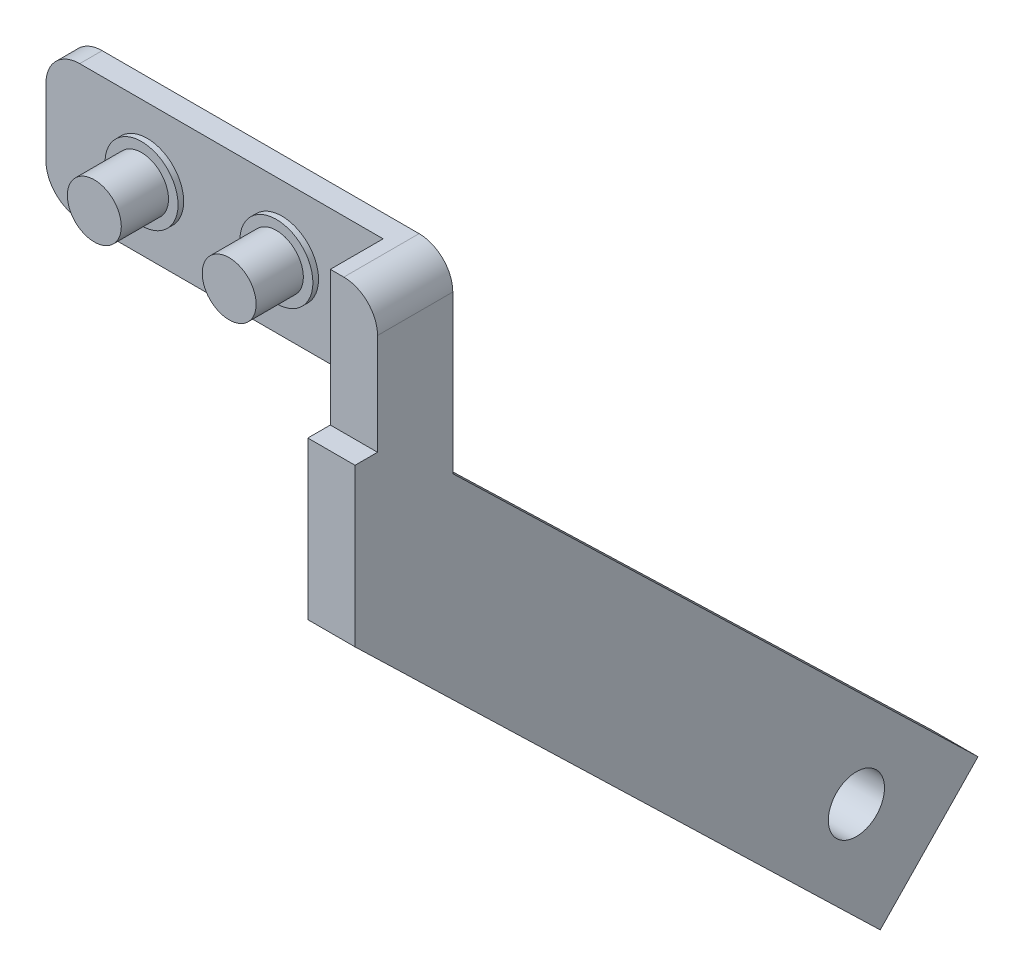
ISO-10303-21;
HEADER;
FILE_DESCRIPTION(('STEP AP214'),'2;1');
FILE_NAME('part.step','',(''),(''),'','','');
FILE_SCHEMA(('AUTOMOTIVE_DESIGN { 1 0 10303 214 1 1 1 1 }'));
ENDSEC;
DATA;
#1=APPLICATION_CONTEXT('core data for automotive mechanical design processes');
#2=APPLICATION_PROTOCOL_DEFINITION('international standard','automotive_design',2000,#1);
#3=PRODUCT_CONTEXT('',#1,'mechanical');
#4=PRODUCT('Part','Part','',(#3));
#5=PRODUCT_RELATED_PRODUCT_CATEGORY('part','',(#4));
#6=PRODUCT_DEFINITION_FORMATION('','',#4);
#7=PRODUCT_DEFINITION_CONTEXT('part definition',#1,'design');
#8=PRODUCT_DEFINITION('design','',#6,#7);
#9=PRODUCT_DEFINITION_SHAPE('','',#8);
#10=(LENGTH_UNIT() NAMED_UNIT(*) SI_UNIT(.MILLI.,.METRE.));
#11=(NAMED_UNIT(*) PLANE_ANGLE_UNIT() SI_UNIT($,.RADIAN.));
#12=(NAMED_UNIT(*) SI_UNIT($,.STERADIAN.) SOLID_ANGLE_UNIT());
#13=UNCERTAINTY_MEASURE_WITH_UNIT(LENGTH_MEASURE(1.E-05),#10,'distance_accuracy_value','');
#14=(GEOMETRIC_REPRESENTATION_CONTEXT(3) GLOBAL_UNCERTAINTY_ASSIGNED_CONTEXT((#13)) GLOBAL_UNIT_ASSIGNED_CONTEXT((#10,
#11,#12)) REPRESENTATION_CONTEXT('',''));
#15=CARTESIAN_POINT('',(0.,0.,0.));
#16=DIRECTION('',(0.,0.,1.));
#17=DIRECTION('',(1.,0.,0.));
#18=AXIS2_PLACEMENT_3D('',#15,#16,#17);
#19=CARTESIAN_POINT('',(21.3907010979574,4.97647058823529,6.7));
#20=DIRECTION('',(0.,0.,-1.));
#21=DIRECTION('',(0.,1.,0.));
#22=AXIS2_PLACEMENT_3D('',#19,#20,#21);
#23=PLANE('',#22);
#24=DIRECTION('',(0.,-1.,0.));
#25=VECTOR('',#24,1.);
#26=CARTESIAN_POINT('',(21.3907010979574,4.97647058823529,6.7));
#27=LINE('',#26,#25);
#28=CARTESIAN_POINT('',(21.3907010979574,1.97647058823529,6.7));
#29=VERTEX_POINT('',#28);
#30=CARTESIAN_POINT('',(21.3907010979574,-7.02352941176471,6.7));
#31=VERTEX_POINT('',#30);
#32=EDGE_CURVE('E186',#29,#31,#27,.T.);
#33=ORIENTED_EDGE('',*,*,#32,.F.);
#34=CARTESIAN_POINT('',(18.3907010979574,1.97647058823529,6.7));
#35=DIRECTION('',(0.,0.,-1.));
#36=DIRECTION('',(0.,1.,0.));
#37=AXIS2_PLACEMENT_3D('',#34,#35,#36);
#38=CIRCLE('',#37,3.);
#39=CARTESIAN_POINT('',(18.3907010979574,4.97647058823529,6.7));
#40=VERTEX_POINT('',#39);
#41=EDGE_CURVE('E246',#29,#40,#38,.F.);
#42=ORIENTED_EDGE('',*,*,#41,.T.);
#43=DIRECTION('',(-1.,0.,0.));
#44=VECTOR('',#43,1.);
#45=CARTESIAN_POINT('',(21.3907010979574,4.97647058823529,6.7));
#46=LINE('',#45,#44);
#47=CARTESIAN_POINT('',(17.1907010979574,4.97647058823529,6.7));
#48=VERTEX_POINT('',#47);
#49=EDGE_CURVE('E198',#40,#48,#46,.T.);
#50=ORIENTED_EDGE('',*,*,#49,.T.);
#51=DIRECTION('',(0.,-1.,0.));
#52=VECTOR('',#51,1.);
#53=CARTESIAN_POINT('',(17.1907010979574,4.97647058823529,6.7));
#54=LINE('',#53,#52);
#55=CARTESIAN_POINT('',(17.1907010979574,-7.02352941176471,6.7));
#56=VERTEX_POINT('',#55);
#57=EDGE_CURVE('E187',#48,#56,#54,.T.);
#58=ORIENTED_EDGE('',*,*,#57,.T.);
#59=DIRECTION('',(-1.,0.,0.));
#60=VECTOR('',#59,1.);
#61=CARTESIAN_POINT('',(17.1907010979574,-7.02352941176471,6.7));
#62=LINE('',#61,#60);
#63=EDGE_CURVE('E163',#31,#56,#62,.T.);
#64=ORIENTED_EDGE('',*,*,#63,.F.);
#65=EDGE_LOOP('',(#33,#42,#50,#58,#64));
#66=FACE_BOUND('',#65,.T.);
#67=ADVANCED_FACE('F32',(#66),#23,.F.);
#68=CARTESIAN_POINT('',(-12.8092989020426,4.97647058823529,2.));
#69=DIRECTION('',(1.,0.,0.));
#70=DIRECTION('',(0.,1.,0.));
#71=AXIS2_PLACEMENT_3D('',#68,#69,#70);
#72=PLANE('',#71);
#73=DIRECTION('',(0.,-1.,0.));
#74=VECTOR('',#73,1.);
#75=CARTESIAN_POINT('',(-12.8092989020426,4.97647058823529,2.));
#76=LINE('',#75,#74);
#77=CARTESIAN_POINT('',(-12.8092989020426,1.97647058823529,2.));
#78=VERTEX_POINT('',#77);
#79=CARTESIAN_POINT('',(-12.8092989020426,-4.02352941176471,2.));
#80=VERTEX_POINT('',#79);
#81=EDGE_CURVE('E225',#78,#80,#76,.T.);
#82=ORIENTED_EDGE('',*,*,#81,.F.);
#83=DIRECTION('',(0.,0.,-1.));
#84=VECTOR('',#83,1.);
#85=CARTESIAN_POINT('',(-12.8092989020426,1.97647058823529,2.));
#86=LINE('',#85,#84);
#87=CARTESIAN_POINT('',(-12.8092989020426,1.97647058823529,0.));
#88=VERTEX_POINT('',#87);
#89=EDGE_CURVE('E259',#78,#88,#86,.T.);
#90=ORIENTED_EDGE('',*,*,#89,.T.);
#91=DIRECTION('',(0.,-1.,0.));
#92=VECTOR('',#91,1.);
#93=CARTESIAN_POINT('',(-12.8092989020426,4.97647058823529,0.));
#94=LINE('',#93,#92);
#95=CARTESIAN_POINT('',(-12.8092989020426,-4.02352941176471,0.));
#96=VERTEX_POINT('',#95);
#97=EDGE_CURVE('E222',#88,#96,#94,.T.);
#98=ORIENTED_EDGE('',*,*,#97,.T.);
#99=DIRECTION('',(0.,0.,-1.));
#100=VECTOR('',#99,1.);
#101=CARTESIAN_POINT('',(-12.8092989020426,-4.02352941176471,2.));
#102=LINE('',#101,#100);
#103=EDGE_CURVE('E55',#96,#80,#102,.F.);
#104=ORIENTED_EDGE('',*,*,#103,.T.);
#105=EDGE_LOOP('',(#82,#90,#98,#104));
#106=FACE_BOUND('',#105,.T.);
#107=ADVANCED_FACE('F268',(#106),#72,.F.);
#108=CARTESIAN_POINT('',(-12.8092989020426,-7.02352941176471,2.));
#109=DIRECTION('',(0.,1.,0.));
#110=DIRECTION('',(0.,0.,1.));
#111=AXIS2_PLACEMENT_3D('',#108,#109,#110);
#112=PLANE('',#111);
#113=DIRECTION('',(1.,0.,0.));
#114=VECTOR('',#113,1.);
#115=CARTESIAN_POINT('',(-12.8092989020426,-7.02352941176471,2.));
#116=LINE('',#115,#114);
#117=CARTESIAN_POINT('',(-9.80929890204256,-7.02352941176471,2.));
#118=VERTEX_POINT('',#117);
#119=CARTESIAN_POINT('',(17.1907010979574,-7.02352941176471,2.));
#120=VERTEX_POINT('',#119);
#121=EDGE_CURVE('E227',#118,#120,#116,.T.);
#122=ORIENTED_EDGE('',*,*,#121,.F.);
#123=DIRECTION('',(0.,0.,-1.));
#124=VECTOR('',#123,1.);
#125=CARTESIAN_POINT('',(-9.80929890204256,-7.02352941176471,2.));
#126=LINE('',#125,#124);
#127=CARTESIAN_POINT('',(-9.80929890204256,-7.02352941176471,0.));
#128=VERTEX_POINT('',#127);
#129=EDGE_CURVE('E11',#118,#128,#126,.T.);
#130=ORIENTED_EDGE('',*,*,#129,.T.);
#131=DIRECTION('',(1.,0.,0.));
#132=VECTOR('',#131,1.);
#133=CARTESIAN_POINT('',(-12.8092989020426,-7.02352941176471,0.));
#134=LINE('',#133,#132);
#135=CARTESIAN_POINT('',(17.1907010979574,-7.02352941176471,0.));
#136=VERTEX_POINT('',#135);
#137=EDGE_CURVE('E237',#128,#136,#134,.T.);
#138=ORIENTED_EDGE('',*,*,#137,.T.);
#139=DIRECTION('',(0.,0.,-1.));
#140=VECTOR('',#139,1.);
#141=CARTESIAN_POINT('',(17.1907010979574,-7.02352941176471,2.));
#142=LINE('',#141,#140);
#143=EDGE_CURVE('E235',#120,#136,#142,.T.);
#144=ORIENTED_EDGE('',*,*,#143,.F.);
#145=EDGE_LOOP('',(#122,#130,#138,#144));
#146=FACE_BOUND('',#145,.T.);
#147=ADVANCED_FACE('F337',(#146),#112,.F.);
#148=CARTESIAN_POINT('',(-12.8092989020426,4.97647058823529,2.));
#149=DIRECTION('',(0.,-1.,0.));
#150=DIRECTION('',(0.,0.,-1.));
#151=AXIS2_PLACEMENT_3D('',#148,#149,#150);
#152=PLANE('',#151);
#153=ORIENTED_EDGE('',*,*,#49,.F.);
#154=DIRECTION('',(0.,0.,1.));
#155=VECTOR('',#154,1.);
#156=CARTESIAN_POINT('',(18.3907010979574,4.97647058823529,2.));
#157=LINE('',#156,#155);
#158=CARTESIAN_POINT('',(18.3907010979574,4.97647058823529,0.));
#159=VERTEX_POINT('',#158);
#160=EDGE_CURVE('E250',#40,#159,#157,.F.);
#161=ORIENTED_EDGE('',*,*,#160,.T.);
#162=DIRECTION('',(-1.,0.,0.));
#163=VECTOR('',#162,1.);
#164=CARTESIAN_POINT('',(-12.8092989020426,4.97647058823529,0.));
#165=LINE('',#164,#163);
#166=CARTESIAN_POINT('',(-9.80929890204256,4.97647058823529,0.));
#167=VERTEX_POINT('',#166);
#168=EDGE_CURVE('E228',#159,#167,#165,.T.);
#169=ORIENTED_EDGE('',*,*,#168,.T.);
#170=DIRECTION('',(0.,0.,-1.));
#171=VECTOR('',#170,1.);
#172=CARTESIAN_POINT('',(-9.80929890204256,4.97647058823529,2.));
#173=LINE('',#172,#171);
#174=CARTESIAN_POINT('',(-9.80929890204256,4.97647058823529,2.));
#175=VERTEX_POINT('',#174);
#176=EDGE_CURVE('E248',#167,#175,#173,.F.);
#177=ORIENTED_EDGE('',*,*,#176,.T.);
#178=DIRECTION('',(-1.,0.,0.));
#179=VECTOR('',#178,1.);
#180=CARTESIAN_POINT('',(-12.8092989020426,4.97647058823529,2.));
#181=LINE('',#180,#179);
#182=CARTESIAN_POINT('',(17.1907010979574,4.97647058823529,2.));
#183=VERTEX_POINT('',#182);
#184=EDGE_CURVE('E232',#183,#175,#181,.T.);
#185=ORIENTED_EDGE('',*,*,#184,.F.);
#186=DIRECTION('',(0.,0.,1.));
#187=VECTOR('',#186,1.);
#188=CARTESIAN_POINT('',(17.1907010979574,4.97647058823529,0.));
#189=LINE('',#188,#187);
#190=EDGE_CURVE('E192',#183,#48,#189,.T.);
#191=ORIENTED_EDGE('',*,*,#190,.T.);
#192=EDGE_LOOP('',(#153,#161,#169,#177,#185,#191));
#193=FACE_BOUND('',#192,.T.);
#194=ADVANCED_FACE('F277',(#193),#152,.F.);
#195=CARTESIAN_POINT('',(0.,0.,2.));
#196=DIRECTION('',(0.,0.,1.));
#197=DIRECTION('',(1.,0.,0.));
#198=AXIS2_PLACEMENT_3D('',#195,#196,#197);
#199=PLANE('',#198);
#200=CARTESIAN_POINT('',(-3.80929890204256,-1.02352941176471,2.));
#201=DIRECTION('',(0.,0.,1.));
#202=DIRECTION('',(1.,0.,0.));
#203=AXIS2_PLACEMENT_3D('',#200,#201,#202);
#204=CIRCLE('',#203,3.25);
#205=CARTESIAN_POINT('',(-0.55929890204256,-1.02352941176471,2.));
#206=VERTEX_POINT('',#205);
#207=EDGE_CURVE('E210',#206,#206,#204,.T.);
#208=ORIENTED_EDGE('',*,*,#207,.F.);
#209=EDGE_LOOP('',(#208));
#210=FACE_BOUND('',#209,.T.);
#211=CARTESIAN_POINT('',(8.19070109795744,-1.02352941176471,2.));
#212=DIRECTION('',(0.,0.,1.));
#213=DIRECTION('',(1.,0.,0.));
#214=AXIS2_PLACEMENT_3D('',#211,#212,#213);
#215=CIRCLE('',#214,3.25);
#216=CARTESIAN_POINT('',(11.4407010979574,-1.02352941176471,2.));
#217=VERTEX_POINT('',#216);
#218=EDGE_CURVE('E216',#217,#217,#215,.T.);
#219=ORIENTED_EDGE('',*,*,#218,.F.);
#220=EDGE_LOOP('',(#219));
#221=FACE_BOUND('',#220,.T.);
#222=ORIENTED_EDGE('',*,*,#184,.T.);
#223=CARTESIAN_POINT('',(-9.80929890204256,1.97647058823529,2.));
#224=DIRECTION('',(0.,0.,1.));
#225=DIRECTION('',(1.,0.,0.));
#226=AXIS2_PLACEMENT_3D('',#223,#224,#225);
#227=CIRCLE('',#226,3.);
#228=EDGE_CURVE('E40',#175,#78,#227,.T.);
#229=ORIENTED_EDGE('',*,*,#228,.T.);
#230=ORIENTED_EDGE('',*,*,#81,.T.);
#231=CARTESIAN_POINT('',(-9.80929890204256,-4.02352941176471,2.));
#232=DIRECTION('',(0.,0.,1.));
#233=DIRECTION('',(1.,0.,0.));
#234=AXIS2_PLACEMENT_3D('',#231,#232,#233);
#235=CIRCLE('',#234,3.);
#236=EDGE_CURVE('E47',#80,#118,#235,.T.);
#237=ORIENTED_EDGE('',*,*,#236,.T.);
#238=ORIENTED_EDGE('',*,*,#121,.T.);
#239=DIRECTION('',(0.,1.,0.));
#240=VECTOR('',#239,1.);
#241=CARTESIAN_POINT('',(17.1907010979574,4.97647058823529,2.));
#242=LINE('',#241,#240);
#243=EDGE_CURVE('E230',#120,#183,#242,.T.);
#244=ORIENTED_EDGE('',*,*,#243,.T.);
#245=EDGE_LOOP('',(#222,#229,#230,#237,#238,#244));
#246=FACE_BOUND('',#245,.T.);
#247=ADVANCED_FACE('F263',(#210,#221,#246),#199,.T.);
#248=CARTESIAN_POINT('',(0.,0.,0.));
#249=DIRECTION('',(0.,0.,1.));
#250=DIRECTION('',(1.,0.,0.));
#251=AXIS2_PLACEMENT_3D('',#248,#249,#250);
#252=PLANE('',#251);
#253=ORIENTED_EDGE('',*,*,#168,.F.);
#254=CARTESIAN_POINT('',(18.3907010979574,1.97647058823529,0.));
#255=DIRECTION('',(0.,0.,1.));
#256=DIRECTION('',(1.,0.,0.));
#257=AXIS2_PLACEMENT_3D('',#254,#255,#256);
#258=CIRCLE('',#257,3.);
#259=CARTESIAN_POINT('',(21.3907010979574,1.97647058823529,0.));
#260=VERTEX_POINT('',#259);
#261=EDGE_CURVE('E256',#159,#260,#258,.F.);
#262=ORIENTED_EDGE('',*,*,#261,.T.);
#263=DIRECTION('',(0.,1.,0.));
#264=VECTOR('',#263,1.);
#265=CARTESIAN_POINT('',(21.3907010979574,4.97647058823529,0.));
#266=LINE('',#265,#264);
#267=CARTESIAN_POINT('',(21.3907010979574,-12.0235294117647,0.));
#268=VERTEX_POINT('',#267);
#269=EDGE_CURVE('E184',#268,#260,#266,.T.);
#270=ORIENTED_EDGE('',*,*,#269,.F.);
#271=DIRECTION('',(-1.,0.,0.));
#272=VECTOR('',#271,1.);
#273=CARTESIAN_POINT('',(21.3907010979574,-12.0235294117647,0.));
#274=LINE('',#273,#272);
#275=CARTESIAN_POINT('',(17.1907010979574,-12.0235294117647,0.));
#276=VERTEX_POINT('',#275);
#277=EDGE_CURVE('E189',#268,#276,#274,.T.);
#278=ORIENTED_EDGE('',*,*,#277,.T.);
#279=DIRECTION('',(0.,1.,0.));
#280=VECTOR('',#279,1.);
#281=CARTESIAN_POINT('',(17.1907010979574,4.97647058823529,0.));
#282=LINE('',#281,#280);
#283=EDGE_CURVE('E183',#276,#136,#282,.T.);
#284=ORIENTED_EDGE('',*,*,#283,.T.);
#285=ORIENTED_EDGE('',*,*,#137,.F.);
#286=CARTESIAN_POINT('',(-9.80929890204256,-4.02352941176471,0.));
#287=DIRECTION('',(0.,0.,1.));
#288=DIRECTION('',(1.,0.,0.));
#289=AXIS2_PLACEMENT_3D('',#286,#287,#288);
#290=CIRCLE('',#289,3.);
#291=EDGE_CURVE('E252',#128,#96,#290,.F.);
#292=ORIENTED_EDGE('',*,*,#291,.T.);
#293=ORIENTED_EDGE('',*,*,#97,.F.);
#294=CARTESIAN_POINT('',(-9.80929890204256,1.97647058823529,0.));
#295=DIRECTION('',(0.,0.,1.));
#296=DIRECTION('',(1.,0.,0.));
#297=AXIS2_PLACEMENT_3D('',#294,#295,#296);
#298=CIRCLE('',#297,3.);
#299=EDGE_CURVE('E254',#88,#167,#298,.F.);
#300=ORIENTED_EDGE('',*,*,#299,.T.);
#301=EDGE_LOOP('',(#253,#262,#270,#278,#284,#285,#292,#293,#300));
#302=FACE_BOUND('',#301,.T.);
#303=ADVANCED_FACE('F273',(#302),#252,.F.);
#304=CARTESIAN_POINT('',(8.19070109795744,-1.02352941176471,2.5));
#305=DIRECTION('',(0.,0.,-1.));
#306=DIRECTION('',(-1.,0.,0.));
#307=AXIS2_PLACEMENT_3D('',#304,#305,#306);
#308=CYLINDRICAL_SURFACE('',#307,3.25);
#309=CARTESIAN_POINT('',(8.19070109795744,-1.02352941176471,2.5));
#310=DIRECTION('',(0.,0.,1.));
#311=DIRECTION('',(1.,0.,0.));
#312=AXIS2_PLACEMENT_3D('',#309,#310,#311);
#313=CIRCLE('',#312,3.25);
#314=CARTESIAN_POINT('',(11.4407010979574,-1.02352941176471,2.5));
#315=VERTEX_POINT('',#314);
#316=EDGE_CURVE('E219',#315,#315,#313,.T.);
#317=ORIENTED_EDGE('',*,*,#316,.F.);
#318=EDGE_LOOP('',(#317));
#319=FACE_BOUND('',#318,.T.);
#320=ORIENTED_EDGE('',*,*,#218,.T.);
#321=EDGE_LOOP('',(#320));
#322=FACE_BOUND('',#321,.T.);
#323=ADVANCED_FACE('F367',(#319,#322),#308,.T.);
#324=CARTESIAN_POINT('',(8.19070109795744,-1.02352941176471,2.5));
#325=DIRECTION('',(0.,0.,1.));
#326=DIRECTION('',(1.,0.,0.));
#327=AXIS2_PLACEMENT_3D('',#324,#325,#326);
#328=PLANE('',#327);
#329=CARTESIAN_POINT('',(8.19070109795744,-1.02352941176471,2.5));
#330=DIRECTION('',(0.,0.,1.));
#331=DIRECTION('',(1.,0.,0.));
#332=AXIS2_PLACEMENT_3D('',#329,#330,#331);
#333=CIRCLE('',#332,2.4);
#334=CARTESIAN_POINT('',(10.5907010979574,-1.02352941176471,2.5));
#335=VERTEX_POINT('',#334);
#336=EDGE_CURVE('E200',#335,#335,#333,.T.);
#337=ORIENTED_EDGE('',*,*,#336,.F.);
#338=EDGE_LOOP('',(#337));
#339=FACE_BOUND('',#338,.T.);
#340=ORIENTED_EDGE('',*,*,#316,.T.);
#341=EDGE_LOOP('',(#340));
#342=FACE_BOUND('',#341,.T.);
#343=ADVANCED_FACE('F363',(#339,#342),#328,.T.);
#344=CARTESIAN_POINT('',(-3.80929890204256,-1.02352941176471,2.5));
#345=DIRECTION('',(0.,0.,-1.));
#346=DIRECTION('',(-1.,0.,0.));
#347=AXIS2_PLACEMENT_3D('',#344,#345,#346);
#348=CYLINDRICAL_SURFACE('',#347,3.25);
#349=CARTESIAN_POINT('',(-3.80929890204256,-1.02352941176471,2.5));
#350=DIRECTION('',(0.,0.,1.));
#351=DIRECTION('',(1.,0.,0.));
#352=AXIS2_PLACEMENT_3D('',#349,#350,#351);
#353=CIRCLE('',#352,3.25);
#354=CARTESIAN_POINT('',(-0.55929890204256,-1.02352941176471,2.5));
#355=VERTEX_POINT('',#354);
#356=EDGE_CURVE('E213',#355,#355,#353,.T.);
#357=ORIENTED_EDGE('',*,*,#356,.F.);
#358=EDGE_LOOP('',(#357));
#359=FACE_BOUND('',#358,.T.);
#360=ORIENTED_EDGE('',*,*,#207,.T.);
#361=EDGE_LOOP('',(#360));
#362=FACE_BOUND('',#361,.T.);
#363=ADVANCED_FACE('F359',(#359,#362),#348,.T.);
#364=CARTESIAN_POINT('',(-3.80929890204256,-1.02352941176471,2.5));
#365=DIRECTION('',(0.,0.,1.));
#366=DIRECTION('',(1.,0.,0.));
#367=AXIS2_PLACEMENT_3D('',#364,#365,#366);
#368=PLANE('',#367);
#369=CARTESIAN_POINT('',(-3.80929890204256,-1.02352941176471,2.5));
#370=DIRECTION('',(0.,0.,1.));
#371=DIRECTION('',(1.,0.,0.));
#372=AXIS2_PLACEMENT_3D('',#369,#370,#371);
#373=CIRCLE('',#372,2.4);
#374=CARTESIAN_POINT('',(-1.40929890204256,-1.02352941176471,2.5));
#375=VERTEX_POINT('',#374);
#376=EDGE_CURVE('E204',#375,#375,#373,.T.);
#377=ORIENTED_EDGE('',*,*,#376,.F.);
#378=EDGE_LOOP('',(#377));
#379=FACE_BOUND('',#378,.T.);
#380=ORIENTED_EDGE('',*,*,#356,.T.);
#381=EDGE_LOOP('',(#380));
#382=FACE_BOUND('',#381,.T.);
#383=ADVANCED_FACE('F355',(#379,#382),#368,.T.);
#384=CARTESIAN_POINT('',(-3.80929890204256,-1.02352941176471,6.7));
#385=DIRECTION('',(0.,0.,-1.));
#386=DIRECTION('',(-1.,0.,0.));
#387=AXIS2_PLACEMENT_3D('',#384,#385,#386);
#388=CYLINDRICAL_SURFACE('',#387,2.4);
#389=CARTESIAN_POINT('',(-3.80929890204256,-1.02352941176471,6.7));
#390=DIRECTION('',(0.,0.,1.));
#391=DIRECTION('',(1.,0.,0.));
#392=AXIS2_PLACEMENT_3D('',#389,#390,#391);
#393=CIRCLE('',#392,2.4);
#394=CARTESIAN_POINT('',(-1.40929890204256,-1.02352941176471,6.7));
#395=VERTEX_POINT('',#394);
#396=EDGE_CURVE('E207',#395,#395,#393,.T.);
#397=ORIENTED_EDGE('',*,*,#396,.F.);
#398=EDGE_LOOP('',(#397));
#399=FACE_BOUND('',#398,.T.);
#400=ORIENTED_EDGE('',*,*,#376,.T.);
#401=EDGE_LOOP('',(#400));
#402=FACE_BOUND('',#401,.T.);
#403=ADVANCED_FACE('F351',(#399,#402),#388,.T.);
#404=CARTESIAN_POINT('',(-3.80929890204256,-1.02352941176471,6.7));
#405=DIRECTION('',(0.,0.,1.));
#406=DIRECTION('',(1.,0.,0.));
#407=AXIS2_PLACEMENT_3D('',#404,#405,#406);
#408=PLANE('',#407);
#409=ORIENTED_EDGE('',*,*,#396,.T.);
#410=EDGE_LOOP('',(#409));
#411=FACE_BOUND('',#410,.T.);
#412=ADVANCED_FACE('F347',(#411),#408,.T.);
#413=CARTESIAN_POINT('',(8.19070109795744,-1.02352941176471,6.7));
#414=DIRECTION('',(0.,0.,-1.));
#415=DIRECTION('',(-1.,0.,0.));
#416=AXIS2_PLACEMENT_3D('',#413,#414,#415);
#417=CYLINDRICAL_SURFACE('',#416,2.4);
#418=CARTESIAN_POINT('',(8.19070109795744,-1.02352941176471,6.7));
#419=DIRECTION('',(0.,0.,1.));
#420=DIRECTION('',(1.,0.,0.));
#421=AXIS2_PLACEMENT_3D('',#418,#419,#420);
#422=CIRCLE('',#421,2.4);
#423=CARTESIAN_POINT('',(10.5907010979574,-1.02352941176471,6.7));
#424=VERTEX_POINT('',#423);
#425=EDGE_CURVE('E201',#424,#424,#422,.T.);
#426=ORIENTED_EDGE('',*,*,#425,.F.);
#427=EDGE_LOOP('',(#426));
#428=FACE_BOUND('',#427,.T.);
#429=ORIENTED_EDGE('',*,*,#336,.T.);
#430=EDGE_LOOP('',(#429));
#431=FACE_BOUND('',#430,.T.);
#432=ADVANCED_FACE('F343',(#428,#431),#417,.T.);
#433=CARTESIAN_POINT('',(8.19070109795744,-1.02352941176471,6.7));
#434=DIRECTION('',(0.,0.,1.));
#435=DIRECTION('',(1.,0.,0.));
#436=AXIS2_PLACEMENT_3D('',#433,#434,#435);
#437=PLANE('',#436);
#438=ORIENTED_EDGE('',*,*,#425,.T.);
#439=EDGE_LOOP('',(#438));
#440=FACE_BOUND('',#439,.T.);
#441=ADVANCED_FACE('F306',(#440),#437,.T.);
#442=CARTESIAN_POINT('',(17.1907010979574,0.,0.));
#443=DIRECTION('',(-1.,0.,0.));
#444=DIRECTION('',(0.,-1.,0.));
#445=AXIS2_PLACEMENT_3D('',#442,#443,#444);
#446=PLANE('',#445);
#447=CARTESIAN_POINT('',(17.1907010979575,-55.4447668352233,-35.9133490587503));
#448=DIRECTION('',(-1.,0.,0.));
#449=DIRECTION('',(0.,-1.,0.));
#450=AXIS2_PLACEMENT_3D('',#447,#448,#449);
#451=CIRCLE('',#450,2.5);
#452=CARTESIAN_POINT('',(17.1907010979575,-57.9447668352233,-35.9133490587503));
#453=VERTEX_POINT('',#452);
#454=EDGE_CURVE('E290',#453,#453,#451,.T.);
#455=ORIENTED_EDGE('',*,*,#454,.F.);
#456=EDGE_LOOP('',(#455));
#457=FACE_BOUND('',#456,.T.);
#458=ORIENTED_EDGE('',*,*,#243,.F.);
#459=ORIENTED_EDGE('',*,*,#143,.T.);
#460=ORIENTED_EDGE('',*,*,#283,.F.);
#461=DIRECTION('',(0.,0.695022096847475,0.718988376049112));
#462=VECTOR('',#461,1.);
#463=CARTESIAN_POINT('',(17.1907010979575,-57.1999657068506,-46.7342444431923));
#464=LINE('',#463,#462);
#465=CARTESIAN_POINT('',(17.1907010979575,-57.1999657068506,-46.7342444431923));
#466=VERTEX_POINT('',#465);
#467=EDGE_CURVE('E165',#466,#276,#464,.T.);
#468=ORIENTED_EDGE('',*,*,#467,.F.);
#469=DIRECTION('',(0.,0.718988376049112,-0.695022096847475));
#470=VECTOR('',#469,1.);
#471=CARTESIAN_POINT('',(17.1907010979574,-66.1999657068506,-38.0342444431923));
#472=LINE('',#471,#470);
#473=CARTESIAN_POINT('',(17.1907010979574,-66.1999657068506,-38.0342444431923));
#474=VERTEX_POINT('',#473);
#475=EDGE_CURVE('E144',#474,#466,#472,.T.);
#476=ORIENTED_EDGE('',*,*,#475,.F.);
#477=DIRECTION('',(0.,0.695022096847475,0.718988376049112));
#478=VECTOR('',#477,1.);
#479=CARTESIAN_POINT('',(17.1907010979574,-66.1999657068506,-38.0342444431923));
#480=LINE('',#479,#478);
#481=CARTESIAN_POINT('',(17.1907010979574,-21.0235294117647,8.7));
#482=VERTEX_POINT('',#481);
#483=EDGE_CURVE('E141',#474,#482,#480,.T.);
#484=ORIENTED_EDGE('',*,*,#483,.T.);
#485=DIRECTION('',(0.,-1.,0.));
#486=VECTOR('',#485,1.);
#487=CARTESIAN_POINT('',(17.1907010979574,-12.0235294117647,8.7));
#488=LINE('',#487,#486);
#489=CARTESIAN_POINT('',(17.1907010979574,-7.02352941176471,8.7));
#490=VERTEX_POINT('',#489);
#491=EDGE_CURVE('E169',#490,#482,#488,.T.);
#492=ORIENTED_EDGE('',*,*,#491,.F.);
#493=DIRECTION('',(0.,0.,-1.));
#494=VECTOR('',#493,1.);
#495=CARTESIAN_POINT('',(17.1907010979574,-7.02352941176471,8.7));
#496=LINE('',#495,#494);
#497=EDGE_CURVE('E175',#490,#56,#496,.T.);
#498=ORIENTED_EDGE('',*,*,#497,.T.);
#499=ORIENTED_EDGE('',*,*,#57,.F.);
#500=ORIENTED_EDGE('',*,*,#190,.F.);
#501=EDGE_LOOP('',(#458,#459,#460,#468,#476,#484,#492,#498,#499,#500));
#502=FACE_BOUND('',#501,.T.);
#503=ADVANCED_FACE('F303',(#457,#502),#446,.T.);
#504=CARTESIAN_POINT('',(21.3907010979574,0.,0.));
#505=DIRECTION('',(-1.,0.,0.));
#506=DIRECTION('',(0.,-1.,0.));
#507=AXIS2_PLACEMENT_3D('',#504,#505,#506);
#508=PLANE('',#507);
#509=CARTESIAN_POINT('',(21.3907010979575,-55.4447668352233,-35.9133490587503));
#510=DIRECTION('',(-1.,0.,0.));
#511=DIRECTION('',(0.,-1.,0.));
#512=AXIS2_PLACEMENT_3D('',#509,#510,#511);
#513=CIRCLE('',#512,2.5);
#514=CARTESIAN_POINT('',(21.3907010979575,-57.9447668352233,-35.9133490587503));
#515=VERTEX_POINT('',#514);
#516=EDGE_CURVE('E154',#515,#515,#513,.T.);
#517=ORIENTED_EDGE('',*,*,#516,.T.);
#518=EDGE_LOOP('',(#517));
#519=FACE_BOUND('',#518,.T.);
#520=ORIENTED_EDGE('',*,*,#269,.T.);
#521=DIRECTION('',(0.,0.,1.));
#522=VECTOR('',#521,1.);
#523=CARTESIAN_POINT('',(21.3907010979574,1.97647058823529,0.));
#524=LINE('',#523,#522);
#525=EDGE_CURVE('E243',#260,#29,#524,.T.);
#526=ORIENTED_EDGE('',*,*,#525,.T.);
#527=ORIENTED_EDGE('',*,*,#32,.T.);
#528=DIRECTION('',(0.,0.,-1.));
#529=VECTOR('',#528,1.);
#530=CARTESIAN_POINT('',(21.3907010979574,-7.02352941176471,8.7));
#531=LINE('',#530,#529);
#532=CARTESIAN_POINT('',(21.3907010979574,-7.02352941176471,8.7));
#533=VERTEX_POINT('',#532);
#534=EDGE_CURVE('E180',#533,#31,#531,.T.);
#535=ORIENTED_EDGE('',*,*,#534,.F.);
#536=DIRECTION('',(0.,1.,0.));
#537=VECTOR('',#536,1.);
#538=CARTESIAN_POINT('',(21.3907010979574,-12.0235294117647,8.7));
#539=LINE('',#538,#537);
#540=CARTESIAN_POINT('',(21.3907010979574,-21.0235294117647,8.7));
#541=VERTEX_POINT('',#540);
#542=EDGE_CURVE('E159',#541,#533,#539,.T.);
#543=ORIENTED_EDGE('',*,*,#542,.F.);
#544=DIRECTION('',(0.,0.695022096847475,0.718988376049112));
#545=VECTOR('',#544,1.);
#546=CARTESIAN_POINT('',(21.3907010979575,-66.1999657068506,-38.0342444431923));
#547=LINE('',#546,#545);
#548=CARTESIAN_POINT('',(21.3907010979575,-66.1999657068506,-38.0342444431923));
#549=VERTEX_POINT('',#548);
#550=EDGE_CURVE('E138',#549,#541,#547,.T.);
#551=ORIENTED_EDGE('',*,*,#550,.F.);
#552=DIRECTION('',(0.,-0.718988376049112,0.695022096847475));
#553=VECTOR('',#552,1.);
#554=CARTESIAN_POINT('',(21.3907010979575,-66.1999657068506,-38.0342444431923));
#555=LINE('',#554,#553);
#556=CARTESIAN_POINT('',(21.3907010979575,-57.1999657068506,-46.7342444431923));
#557=VERTEX_POINT('',#556);
#558=EDGE_CURVE('E145',#557,#549,#555,.T.);
#559=ORIENTED_EDGE('',*,*,#558,.F.);
#560=DIRECTION('',(0.,0.695022096847475,0.718988376049112));
#561=VECTOR('',#560,1.);
#562=CARTESIAN_POINT('',(21.3907010979575,-57.1999657068506,-46.7342444431923));
#563=LINE('',#562,#561);
#564=EDGE_CURVE('E284',#557,#268,#563,.T.);
#565=ORIENTED_EDGE('',*,*,#564,.T.);
#566=EDGE_LOOP('',(#520,#526,#527,#535,#543,#551,#559,#565));
#567=FACE_BOUND('',#566,.T.);
#568=ADVANCED_FACE('F157',(#519,#567),#508,.F.);
#569=CARTESIAN_POINT('',(17.1907010979574,-7.02352941176471,8.7));
#570=DIRECTION('',(0.,-1.,0.));
#571=DIRECTION('',(0.,0.,-1.));
#572=AXIS2_PLACEMENT_3D('',#569,#570,#571);
#573=PLANE('',#572);
#574=ORIENTED_EDGE('',*,*,#63,.T.);
#575=ORIENTED_EDGE('',*,*,#497,.F.);
#576=DIRECTION('',(-1.,0.,0.));
#577=VECTOR('',#576,1.);
#578=CARTESIAN_POINT('',(17.1907010979574,-7.02352941176471,8.7));
#579=LINE('',#578,#577);
#580=EDGE_CURVE('E173',#533,#490,#579,.T.);
#581=ORIENTED_EDGE('',*,*,#580,.F.);
#582=ORIENTED_EDGE('',*,*,#534,.T.);
#583=EDGE_LOOP('',(#574,#575,#581,#582));
#584=FACE_BOUND('',#583,.T.);
#585=ADVANCED_FACE('F318',(#584),#573,.F.);
#586=CARTESIAN_POINT('',(0.,0.,8.7));
#587=DIRECTION('',(0.,0.,-1.));
#588=DIRECTION('',(-1.,0.,0.));
#589=AXIS2_PLACEMENT_3D('',#586,#587,#588);
#590=PLANE('',#589);
#591=ORIENTED_EDGE('',*,*,#491,.T.);
#592=DIRECTION('',(1.,0.,0.));
#593=VECTOR('',#592,1.);
#594=CARTESIAN_POINT('',(17.1907010979574,-21.0235294117647,8.7));
#595=LINE('',#594,#593);
#596=EDGE_CURVE('E161',#482,#541,#595,.T.);
#597=ORIENTED_EDGE('',*,*,#596,.T.);
#598=ORIENTED_EDGE('',*,*,#542,.T.);
#599=ORIENTED_EDGE('',*,*,#580,.T.);
#600=EDGE_LOOP('',(#591,#597,#598,#599));
#601=FACE_BOUND('',#600,.T.);
#602=ADVANCED_FACE('F321',(#601),#590,.F.);
#603=CARTESIAN_POINT('',(18.3907010979574,1.97647058823529,0.));
#604=DIRECTION('',(0.,0.,1.));
#605=DIRECTION('',(1.,0.,0.));
#606=AXIS2_PLACEMENT_3D('',#603,#604,#605);
#607=CYLINDRICAL_SURFACE('',#606,3.);
#608=ORIENTED_EDGE('',*,*,#261,.F.);
#609=ORIENTED_EDGE('',*,*,#160,.F.);
#610=ORIENTED_EDGE('',*,*,#41,.F.);
#611=ORIENTED_EDGE('',*,*,#525,.F.);
#612=EDGE_LOOP('',(#608,#609,#610,#611));
#613=FACE_BOUND('',#612,.T.);
#614=ADVANCED_FACE('F280',(#613),#607,.T.);
#615=CARTESIAN_POINT('',(-9.80929890204256,1.97647058823529,2.));
#616=DIRECTION('',(0.,0.,-1.));
#617=DIRECTION('',(-1.,0.,0.));
#618=AXIS2_PLACEMENT_3D('',#615,#616,#617);
#619=CYLINDRICAL_SURFACE('',#618,3.);
#620=ORIENTED_EDGE('',*,*,#228,.F.);
#621=ORIENTED_EDGE('',*,*,#176,.F.);
#622=ORIENTED_EDGE('',*,*,#299,.F.);
#623=ORIENTED_EDGE('',*,*,#89,.F.);
#624=EDGE_LOOP('',(#620,#621,#622,#623));
#625=FACE_BOUND('',#624,.T.);
#626=ADVANCED_FACE('F270',(#625),#619,.T.);
#627=CARTESIAN_POINT('',(-9.80929890204256,-4.02352941176471,2.));
#628=DIRECTION('',(0.,0.,-1.));
#629=DIRECTION('',(-1.,0.,0.));
#630=AXIS2_PLACEMENT_3D('',#627,#628,#629);
#631=CYLINDRICAL_SURFACE('',#630,3.);
#632=ORIENTED_EDGE('',*,*,#236,.F.);
#633=ORIENTED_EDGE('',*,*,#103,.F.);
#634=ORIENTED_EDGE('',*,*,#291,.F.);
#635=ORIENTED_EDGE('',*,*,#129,.F.);
#636=EDGE_LOOP('',(#632,#633,#634,#635));
#637=FACE_BOUND('',#636,.T.);
#638=ADVANCED_FACE('F34',(#637),#631,.T.);
#639=CARTESIAN_POINT('',(21.3907010979575,-66.1999657068506,-38.0342444431923));
#640=DIRECTION('',(0.,0.718988376049112,-0.695022096847475));
#641=DIRECTION('',(0.,0.695022096847475,0.718988376049112));
#642=AXIS2_PLACEMENT_3D('',#639,#640,#641);
#643=PLANE('',#642);
#644=ORIENTED_EDGE('',*,*,#596,.F.);
#645=ORIENTED_EDGE('',*,*,#483,.F.);
#646=DIRECTION('',(-1.,0.,0.));
#647=VECTOR('',#646,1.);
#648=CARTESIAN_POINT('',(21.3907010979575,-66.1999657068506,-38.0342444431923));
#649=LINE('',#648,#647);
#650=EDGE_CURVE('E134',#549,#474,#649,.T.);
#651=ORIENTED_EDGE('',*,*,#650,.F.);
#652=ORIENTED_EDGE('',*,*,#550,.T.);
#653=EDGE_LOOP('',(#644,#645,#651,#652));
#654=FACE_BOUND('',#653,.T.);
#655=ADVANCED_FACE('F136',(#654),#643,.F.);
#656=CARTESIAN_POINT('',(21.3907010979575,-57.1999657068506,-46.7342444431923));
#657=DIRECTION('',(0.,-0.718988376049112,0.695022096847475));
#658=DIRECTION('',(0.,-0.695022096847475,-0.718988376049112));
#659=AXIS2_PLACEMENT_3D('',#656,#657,#658);
#660=PLANE('',#659);
#661=ORIENTED_EDGE('',*,*,#277,.F.);
#662=ORIENTED_EDGE('',*,*,#564,.F.);
#663=DIRECTION('',(1.,0.,0.));
#664=VECTOR('',#663,1.);
#665=CARTESIAN_POINT('',(21.3907010979575,-57.1999657068506,-46.7342444431923));
#666=LINE('',#665,#664);
#667=EDGE_CURVE('E150',#466,#557,#666,.T.);
#668=ORIENTED_EDGE('',*,*,#667,.F.);
#669=ORIENTED_EDGE('',*,*,#467,.T.);
#670=EDGE_LOOP('',(#661,#662,#668,#669));
#671=FACE_BOUND('',#670,.T.);
#672=ADVANCED_FACE('F323',(#671),#660,.F.);
#673=CARTESIAN_POINT('',(0.,-50.9844708931871,-52.7425560964004));
#674=DIRECTION('',(0.,0.695022096847475,0.718988376049112));
#675=DIRECTION('',(0.,-0.718988376049112,0.695022096847475));
#676=AXIS2_PLACEMENT_3D('',#673,#674,#675);
#677=PLANE('',#676);
#678=ORIENTED_EDGE('',*,*,#558,.T.);
#679=ORIENTED_EDGE('',*,*,#650,.T.);
#680=ORIENTED_EDGE('',*,*,#475,.T.);
#681=ORIENTED_EDGE('',*,*,#667,.T.);
#682=EDGE_LOOP('',(#678,#679,#680,#681));
#683=FACE_BOUND('',#682,.T.);
#684=ADVANCED_FACE('F148',(#683),#677,.F.);
#685=CARTESIAN_POINT('',(21.3907010979575,-55.4447668352233,-35.9133490587503));
#686=DIRECTION('',(-1.,0.,0.));
#687=DIRECTION('',(0.,-1.,0.));
#688=AXIS2_PLACEMENT_3D('',#685,#686,#687);
#689=CYLINDRICAL_SURFACE('',#688,2.5);
#690=ORIENTED_EDGE('',*,*,#516,.F.);
#691=EDGE_LOOP('',(#690));
#692=FACE_BOUND('',#691,.T.);
#693=ORIENTED_EDGE('',*,*,#454,.T.);
#694=EDGE_LOOP('',(#693));
#695=FACE_BOUND('',#694,.T.);
#696=ADVANCED_FACE('F297',(#692,#695),#689,.F.);
#697=CLOSED_SHELL('',(#67,#107,#147,#194,#247,#303,#323,#343,#363,#383,#403,#412,#432,#441,#503,
#568,#585,#602,#614,#626,#638,#655,#672,#684,#696));
#698=MANIFOLD_SOLID_BREP('B2',#697);
#699=ADVANCED_BREP_SHAPE_REPRESENTATION('',(#18,#698),#14);
#700=SHAPE_DEFINITION_REPRESENTATION(#9,#699);
ENDSEC;
END-ISO-10303-21;
